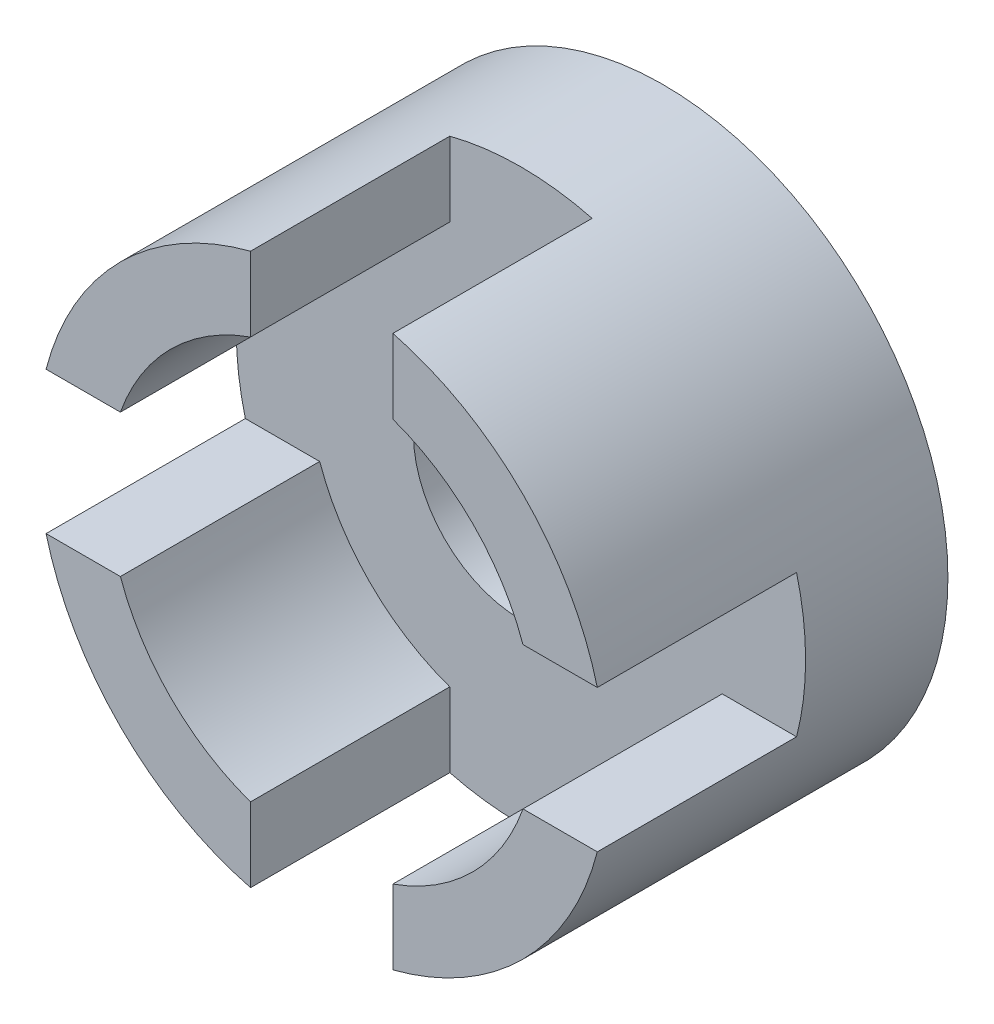
ISO-10303-21;
HEADER;
FILE_DESCRIPTION(('STEP AP214'),'2;1');
FILE_NAME('part.step','',(''),(''),'','','');
FILE_SCHEMA(('AUTOMOTIVE_DESIGN { 1 0 10303 214 1 1 1 1 }'));
ENDSEC;
DATA;
#1=APPLICATION_CONTEXT('core data for automotive mechanical design processes');
#2=APPLICATION_PROTOCOL_DEFINITION('international standard','automotive_design',2000,#1);
#3=PRODUCT_CONTEXT('',#1,'mechanical');
#4=PRODUCT('Part','Part','',(#3));
#5=PRODUCT_RELATED_PRODUCT_CATEGORY('part','',(#4));
#6=PRODUCT_DEFINITION_FORMATION('','',#4);
#7=PRODUCT_DEFINITION_CONTEXT('part definition',#1,'design');
#8=PRODUCT_DEFINITION('design','',#6,#7);
#9=PRODUCT_DEFINITION_SHAPE('','',#8);
#10=(LENGTH_UNIT() NAMED_UNIT(*) SI_UNIT(.MILLI.,.METRE.));
#11=(NAMED_UNIT(*) PLANE_ANGLE_UNIT() SI_UNIT($,.RADIAN.));
#12=(NAMED_UNIT(*) SI_UNIT($,.STERADIAN.) SOLID_ANGLE_UNIT());
#13=UNCERTAINTY_MEASURE_WITH_UNIT(LENGTH_MEASURE(1.E-05),#10,'distance_accuracy_value','');
#14=(GEOMETRIC_REPRESENTATION_CONTEXT(3) GLOBAL_UNCERTAINTY_ASSIGNED_CONTEXT((#13)) GLOBAL_UNIT_ASSIGNED_CONTEXT((#10,
#11,#12)) REPRESENTATION_CONTEXT('',''));
#15=CARTESIAN_POINT('',(0.,0.,0.));
#16=DIRECTION('',(0.,0.,1.));
#17=DIRECTION('',(1.,0.,0.));
#18=AXIS2_PLACEMENT_3D('',#15,#16,#17);
#19=CARTESIAN_POINT('',(0.,0.,7.62));
#20=DIRECTION('',(0.,0.,-1.));
#21=DIRECTION('',(-1.,0.,0.));
#22=AXIS2_PLACEMENT_3D('',#19,#20,#21);
#23=CYLINDRICAL_SURFACE('',#22,6.35);
#24=CARTESIAN_POINT('',(0.,0.,0.));
#25=DIRECTION('',(0.,0.,1.));
#26=DIRECTION('',(1.,0.,0.));
#27=AXIS2_PLACEMENT_3D('',#24,#25,#26);
#28=CIRCLE('',#27,6.35);
#29=CARTESIAN_POINT('',(6.35,0.,0.));
#30=VERTEX_POINT('',#29);
#31=EDGE_CURVE('E51',#30,#30,#28,.T.);
#32=ORIENTED_EDGE('',*,*,#31,.T.);
#33=EDGE_LOOP('',(#32));
#34=FACE_BOUND('',#33,.T.);
#35=DIRECTION('',(0.,0.,1.));
#36=VECTOR('',#35,1.);
#37=CARTESIAN_POINT('',(-6.14836106210428,1.58749999999998,-0.504639742041458));
#38=LINE('',#37,#36);
#39=CARTESIAN_POINT('',(-6.14836106210428,1.58749999999998,3.175));
#40=VERTEX_POINT('',#39);
#41=CARTESIAN_POINT('',(-6.14836106210428,1.58749999999998,7.62));
#42=VERTEX_POINT('',#41);
#43=EDGE_CURVE('E165',#40,#42,#38,.T.);
#44=ORIENTED_EDGE('',*,*,#43,.T.);
#45=CARTESIAN_POINT('',(0.,0.,7.62));
#46=DIRECTION('',(0.,0.,1.));
#47=DIRECTION('',(1.,0.,0.));
#48=AXIS2_PLACEMENT_3D('',#45,#46,#47);
#49=CIRCLE('',#48,6.35);
#50=CARTESIAN_POINT('',(-1.5875,6.14836106210428,7.62));
#51=VERTEX_POINT('',#50);
#52=EDGE_CURVE('E12',#51,#42,#49,.T.);
#53=ORIENTED_EDGE('',*,*,#52,.F.);
#54=DIRECTION('',(0.,0.,1.));
#55=VECTOR('',#54,1.);
#56=CARTESIAN_POINT('',(-1.5875,6.14836106210428,-0.504639742041451));
#57=LINE('',#56,#55);
#58=CARTESIAN_POINT('',(-1.5875,6.14836106210428,3.175));
#59=VERTEX_POINT('',#58);
#60=EDGE_CURVE('E194',#59,#51,#57,.T.);
#61=ORIENTED_EDGE('',*,*,#60,.F.);
#62=CARTESIAN_POINT('',(0.,0.,3.175));
#63=DIRECTION('',(0.,0.,1.));
#64=DIRECTION('',(1.,0.,0.));
#65=AXIS2_PLACEMENT_3D('',#62,#63,#64);
#66=CIRCLE('',#65,6.35);
#67=CARTESIAN_POINT('',(1.5875,6.14836106210427,3.175));
#68=VERTEX_POINT('',#67);
#69=EDGE_CURVE('E207',#59,#68,#66,.F.);
#70=ORIENTED_EDGE('',*,*,#69,.T.);
#71=DIRECTION('',(0.,0.,1.));
#72=VECTOR('',#71,1.);
#73=CARTESIAN_POINT('',(1.5875,6.14836106210427,-0.504639742041451));
#74=LINE('',#73,#72);
#75=CARTESIAN_POINT('',(1.5875,6.14836106210427,7.62));
#76=VERTEX_POINT('',#75);
#77=EDGE_CURVE('E190',#68,#76,#74,.T.);
#78=ORIENTED_EDGE('',*,*,#77,.T.);
#79=CARTESIAN_POINT('',(6.14836106210426,1.58750000000006,7.62));
#80=VERTEX_POINT('',#79);
#81=EDGE_CURVE('E57',#80,#76,#49,.T.);
#82=ORIENTED_EDGE('',*,*,#81,.F.);
#83=DIRECTION('',(0.,0.,1.));
#84=VECTOR('',#83,1.);
#85=CARTESIAN_POINT('',(6.14836106210426,1.58750000000006,-0.504639742041474));
#86=LINE('',#85,#84);
#87=CARTESIAN_POINT('',(6.14836106210426,1.58750000000006,3.175));
#88=VERTEX_POINT('',#87);
#89=EDGE_CURVE('E288',#88,#80,#86,.T.);
#90=ORIENTED_EDGE('',*,*,#89,.F.);
#91=CARTESIAN_POINT('',(0.,0.,3.175));
#92=DIRECTION('',(0.,0.,1.));
#93=DIRECTION('',(1.,0.,0.));
#94=AXIS2_PLACEMENT_3D('',#91,#92,#93);
#95=CIRCLE('',#94,6.35);
#96=CARTESIAN_POINT('',(6.14836106210429,-1.58749999999994,3.175));
#97=VERTEX_POINT('',#96);
#98=EDGE_CURVE('E263',#88,#97,#95,.F.);
#99=ORIENTED_EDGE('',*,*,#98,.T.);
#100=DIRECTION('',(0.,0.,1.));
#101=VECTOR('',#100,1.);
#102=CARTESIAN_POINT('',(6.14836106210429,-1.58749999999994,-0.504639742041474));
#103=LINE('',#102,#101);
#104=CARTESIAN_POINT('',(6.14836106210429,-1.58749999999994,7.62));
#105=VERTEX_POINT('',#104);
#106=EDGE_CURVE('E284',#97,#105,#103,.T.);
#107=ORIENTED_EDGE('',*,*,#106,.T.);
#108=CARTESIAN_POINT('',(1.5875,-6.14836106210428,7.62));
#109=VERTEX_POINT('',#108);
#110=EDGE_CURVE('E344',#109,#105,#49,.T.);
#111=ORIENTED_EDGE('',*,*,#110,.F.);
#112=DIRECTION('',(0.,0.,1.));
#113=VECTOR('',#112,1.);
#114=CARTESIAN_POINT('',(1.5875,-6.14836106210428,-0.504639742041451));
#115=LINE('',#114,#113);
#116=CARTESIAN_POINT('',(1.5875,-6.14836106210428,3.175));
#117=VERTEX_POINT('',#116);
#118=EDGE_CURVE('E268',#117,#109,#115,.T.);
#119=ORIENTED_EDGE('',*,*,#118,.F.);
#120=CARTESIAN_POINT('',(0.,0.,3.175));
#121=DIRECTION('',(0.,0.,1.));
#122=DIRECTION('',(1.,0.,0.));
#123=AXIS2_PLACEMENT_3D('',#120,#121,#122);
#124=CIRCLE('',#123,6.35);
#125=CARTESIAN_POINT('',(-1.5875,-6.14836106210427,3.175));
#126=VERTEX_POINT('',#125);
#127=EDGE_CURVE('E173',#117,#126,#124,.F.);
#128=ORIENTED_EDGE('',*,*,#127,.T.);
#129=DIRECTION('',(0.,0.,1.));
#130=VECTOR('',#129,1.);
#131=CARTESIAN_POINT('',(-1.5875,-6.14836106210427,-0.504639742041451));
#132=LINE('',#131,#130);
#133=CARTESIAN_POINT('',(-1.5875,-6.14836106210427,7.62));
#134=VERTEX_POINT('',#133);
#135=EDGE_CURVE('E265',#126,#134,#132,.T.);
#136=ORIENTED_EDGE('',*,*,#135,.T.);
#137=CARTESIAN_POINT('',(-6.14836106210427,-1.58750000000002,7.62));
#138=VERTEX_POINT('',#137);
#139=EDGE_CURVE('E56',#138,#134,#49,.T.);
#140=ORIENTED_EDGE('',*,*,#139,.F.);
#141=DIRECTION('',(0.,0.,1.));
#142=VECTOR('',#141,1.);
#143=CARTESIAN_POINT('',(-6.14836106210427,-1.58750000000002,-0.504639742041458));
#144=LINE('',#143,#142);
#145=CARTESIAN_POINT('',(-6.14836106210427,-1.58750000000002,3.175));
#146=VERTEX_POINT('',#145);
#147=EDGE_CURVE('E181',#146,#138,#144,.T.);
#148=ORIENTED_EDGE('',*,*,#147,.F.);
#149=CARTESIAN_POINT('',(0.,0.,3.175));
#150=DIRECTION('',(0.,0.,1.));
#151=DIRECTION('',(1.,0.,0.));
#152=AXIS2_PLACEMENT_3D('',#149,#150,#151);
#153=CIRCLE('',#152,6.35);
#154=EDGE_CURVE('E180',#146,#40,#153,.F.);
#155=ORIENTED_EDGE('',*,*,#154,.T.);
#156=EDGE_LOOP('',(#44,#53,#61,#70,#78,#82,#90,#99,#107,#111,#119,#128,#136,#140,#148,#155));
#157=FACE_BOUND('',#156,.T.);
#158=ADVANCED_FACE('F48',(#34,#157),#23,.T.);
#159=CARTESIAN_POINT('',(0.,0.,7.62));
#160=DIRECTION('',(0.,0.,1.));
#161=DIRECTION('',(1.,0.,0.));
#162=AXIS2_PLACEMENT_3D('',#159,#160,#161);
#163=PLANE('',#162);
#164=ORIENTED_EDGE('',*,*,#52,.T.);
#165=DIRECTION('',(1.,0.,0.));
#166=VECTOR('',#165,1.);
#167=CARTESIAN_POINT('',(0.,1.5875,7.62));
#168=LINE('',#167,#166);
#169=CARTESIAN_POINT('',(-4.49012806053458,1.58749999999998,7.62));
#170=VERTEX_POINT('',#169);
#171=EDGE_CURVE('E162',#42,#170,#168,.T.);
#172=ORIENTED_EDGE('',*,*,#171,.T.);
#173=CARTESIAN_POINT('',(0.,0.,7.62));
#174=DIRECTION('',(0.,0.,1.));
#175=DIRECTION('',(1.,0.,0.));
#176=AXIS2_PLACEMENT_3D('',#173,#174,#175);
#177=CIRCLE('',#176,4.7625);
#178=CARTESIAN_POINT('',(-1.5875,4.49012806053458,7.62));
#179=VERTEX_POINT('',#178);
#180=EDGE_CURVE('E186',#179,#170,#177,.T.);
#181=ORIENTED_EDGE('',*,*,#180,.F.);
#182=DIRECTION('',(0.,-1.,0.));
#183=VECTOR('',#182,1.);
#184=CARTESIAN_POINT('',(-1.5875,0.,7.62));
#185=LINE('',#184,#183);
#186=EDGE_CURVE('E185',#51,#179,#185,.T.);
#187=ORIENTED_EDGE('',*,*,#186,.F.);
#188=EDGE_LOOP('',(#164,#172,#181,#187));
#189=FACE_BOUND('',#188,.T.);
#190=ADVANCED_FACE('F184',(#189),#163,.T.);
#191=DIRECTION('',(1.,0.,0.));
#192=VECTOR('',#191,1.);
#193=CARTESIAN_POINT('',(0.,-1.5875,7.62));
#194=LINE('',#193,#192);
#195=CARTESIAN_POINT('',(-4.49012806053457,-1.58750000000002,7.62));
#196=VERTEX_POINT('',#195);
#197=EDGE_CURVE('E172',#138,#196,#194,.T.);
#198=ORIENTED_EDGE('',*,*,#197,.F.);
#199=ORIENTED_EDGE('',*,*,#139,.T.);
#200=DIRECTION('',(0.,1.,0.));
#201=VECTOR('',#200,1.);
#202=CARTESIAN_POINT('',(-1.5875,0.,7.62));
#203=LINE('',#202,#201);
#204=CARTESIAN_POINT('',(-1.5875,-4.49012806053458,7.62));
#205=VERTEX_POINT('',#204);
#206=EDGE_CURVE('E259',#134,#205,#203,.T.);
#207=ORIENTED_EDGE('',*,*,#206,.T.);
#208=EDGE_CURVE('E220',#196,#205,#177,.T.);
#209=ORIENTED_EDGE('',*,*,#208,.F.);
#210=EDGE_LOOP('',(#198,#199,#207,#209));
#211=FACE_BOUND('',#210,.T.);
#212=ADVANCED_FACE('F314',(#211),#163,.T.);
#213=DIRECTION('',(0.,1.,0.));
#214=VECTOR('',#213,1.);
#215=CARTESIAN_POINT('',(1.5875,0.,7.62));
#216=LINE('',#215,#214);
#217=CARTESIAN_POINT('',(1.5875,-4.49012806053458,7.62));
#218=VERTEX_POINT('',#217);
#219=EDGE_CURVE('E262',#109,#218,#216,.T.);
#220=ORIENTED_EDGE('',*,*,#219,.F.);
#221=ORIENTED_EDGE('',*,*,#110,.T.);
#222=DIRECTION('',(-1.,0.,0.));
#223=VECTOR('',#222,1.);
#224=CARTESIAN_POINT('',(0.,-1.5875,7.62));
#225=LINE('',#224,#223);
#226=CARTESIAN_POINT('',(4.49012806053459,-1.58749999999995,7.62));
#227=VERTEX_POINT('',#226);
#228=EDGE_CURVE('E279',#105,#227,#225,.T.);
#229=ORIENTED_EDGE('',*,*,#228,.T.);
#230=EDGE_CURVE('E515',#218,#227,#177,.T.);
#231=ORIENTED_EDGE('',*,*,#230,.F.);
#232=EDGE_LOOP('',(#220,#221,#229,#231));
#233=FACE_BOUND('',#232,.T.);
#234=ADVANCED_FACE('F305',(#233),#163,.T.);
#235=CARTESIAN_POINT('',(0.,0.,-13.4703841816037));
#236=DIRECTION('',(0.,0.,1.));
#237=DIRECTION('',(1.,0.,0.));
#238=AXIS2_PLACEMENT_3D('',#235,#236,#237);
#239=CYLINDRICAL_SURFACE('',#238,4.7625);
#240=DIRECTION('',(0.,0.,1.));
#241=VECTOR('',#240,1.);
#242=CARTESIAN_POINT('',(-4.49012806053458,1.58749999999998,-0.504639742041458));
#243=LINE('',#242,#241);
#244=CARTESIAN_POINT('',(-4.49012806053458,1.58749999999999,3.175));
#245=VERTEX_POINT('',#244);
#246=EDGE_CURVE('E168',#245,#170,#243,.T.);
#247=ORIENTED_EDGE('',*,*,#246,.F.);
#248=CARTESIAN_POINT('',(0.,0.,3.175));
#249=DIRECTION('',(0.,0.,1.));
#250=DIRECTION('',(1.,0.,0.));
#251=AXIS2_PLACEMENT_3D('',#248,#249,#250);
#252=CIRCLE('',#251,4.7625);
#253=CARTESIAN_POINT('',(-1.5875,4.49012806053458,3.175));
#254=VERTEX_POINT('',#253);
#255=EDGE_CURVE('E219',#245,#254,#252,.F.);
#256=ORIENTED_EDGE('',*,*,#255,.T.);
#257=DIRECTION('',(0.,0.,1.));
#258=VECTOR('',#257,1.);
#259=CARTESIAN_POINT('',(-1.5875,4.49012806053458,-0.504639742041451));
#260=LINE('',#259,#258);
#261=EDGE_CURVE('E204',#254,#179,#260,.T.);
#262=ORIENTED_EDGE('',*,*,#261,.T.);
#263=ORIENTED_EDGE('',*,*,#180,.T.);
#264=EDGE_LOOP('',(#247,#256,#262,#263));
#265=FACE_BOUND('',#264,.T.);
#266=ADVANCED_FACE('F303',(#265),#239,.F.);
#267=CARTESIAN_POINT('',(-1.5875,-4.49012806053458,3.175));
#268=VERTEX_POINT('',#267);
#269=CARTESIAN_POINT('',(-4.49012806053457,-1.58750000000002,3.175));
#270=VERTEX_POINT('',#269);
#271=EDGE_CURVE('E230',#268,#270,#252,.F.);
#272=ORIENTED_EDGE('',*,*,#271,.T.);
#273=DIRECTION('',(0.,0.,1.));
#274=VECTOR('',#273,1.);
#275=CARTESIAN_POINT('',(-4.49012806053457,-1.58750000000002,-0.504639742041458));
#276=LINE('',#275,#274);
#277=EDGE_CURVE('E64',#270,#196,#276,.T.);
#278=ORIENTED_EDGE('',*,*,#277,.T.);
#279=ORIENTED_EDGE('',*,*,#208,.T.);
#280=DIRECTION('',(0.,0.,1.));
#281=VECTOR('',#280,1.);
#282=CARTESIAN_POINT('',(-1.5875,-4.49012806053458,-0.504639742041451));
#283=LINE('',#282,#281);
#284=EDGE_CURVE('E240',#268,#205,#283,.T.);
#285=ORIENTED_EDGE('',*,*,#284,.F.);
#286=EDGE_LOOP('',(#272,#278,#279,#285));
#287=FACE_BOUND('',#286,.T.);
#288=ADVANCED_FACE('F237',(#287),#239,.F.);
#289=CARTESIAN_POINT('',(4.49012806053459,-1.58749999999995,3.175));
#290=VERTEX_POINT('',#289);
#291=CARTESIAN_POINT('',(1.5875,-4.49012806053458,3.175));
#292=VERTEX_POINT('',#291);
#293=EDGE_CURVE('E223',#290,#292,#252,.F.);
#294=ORIENTED_EDGE('',*,*,#293,.T.);
#295=DIRECTION('',(0.,0.,1.));
#296=VECTOR('',#295,1.);
#297=CARTESIAN_POINT('',(1.5875,-4.49012806053458,-0.504639742041451));
#298=LINE('',#297,#296);
#299=EDGE_CURVE('E72',#292,#218,#298,.T.);
#300=ORIENTED_EDGE('',*,*,#299,.T.);
#301=ORIENTED_EDGE('',*,*,#230,.T.);
#302=DIRECTION('',(0.,0.,1.));
#303=VECTOR('',#302,1.);
#304=CARTESIAN_POINT('',(4.49012806053459,-1.58749999999995,-0.504639742041474));
#305=LINE('',#304,#303);
#306=EDGE_CURVE('E277',#290,#227,#305,.T.);
#307=ORIENTED_EDGE('',*,*,#306,.F.);
#308=EDGE_LOOP('',(#294,#300,#301,#307));
#309=FACE_BOUND('',#308,.T.);
#310=ADVANCED_FACE('F312',(#309),#239,.F.);
#311=DIRECTION('',(-1.,0.,0.));
#312=VECTOR('',#311,1.);
#313=CARTESIAN_POINT('',(0.,1.5875,7.62));
#314=LINE('',#313,#312);
#315=CARTESIAN_POINT('',(4.49012806053456,1.58750000000005,7.62));
#316=VERTEX_POINT('',#315);
#317=EDGE_CURVE('E282',#80,#316,#314,.T.);
#318=ORIENTED_EDGE('',*,*,#317,.F.);
#319=ORIENTED_EDGE('',*,*,#81,.T.);
#320=DIRECTION('',(0.,-1.,0.));
#321=VECTOR('',#320,1.);
#322=CARTESIAN_POINT('',(1.5875,0.,7.62));
#323=LINE('',#322,#321);
#324=CARTESIAN_POINT('',(1.5875,4.49012806053458,7.62));
#325=VERTEX_POINT('',#324);
#326=EDGE_CURVE('E191',#76,#325,#323,.T.);
#327=ORIENTED_EDGE('',*,*,#326,.T.);
#328=EDGE_CURVE('E217',#316,#325,#177,.T.);
#329=ORIENTED_EDGE('',*,*,#328,.F.);
#330=EDGE_LOOP('',(#318,#319,#327,#329));
#331=FACE_BOUND('',#330,.T.);
#332=ADVANCED_FACE('F317',(#331),#163,.T.);
#333=CARTESIAN_POINT('',(1.5875,4.49012806053458,3.175));
#334=VERTEX_POINT('',#333);
#335=CARTESIAN_POINT('',(4.49012806053456,1.58750000000005,3.175));
#336=VERTEX_POINT('',#335);
#337=EDGE_CURVE('E221',#334,#336,#252,.F.);
#338=ORIENTED_EDGE('',*,*,#337,.T.);
#339=DIRECTION('',(0.,0.,1.));
#340=VECTOR('',#339,1.);
#341=CARTESIAN_POINT('',(4.49012806053456,1.58750000000005,-0.504639742041474));
#342=LINE('',#341,#340);
#343=EDGE_CURVE('E286',#336,#316,#342,.T.);
#344=ORIENTED_EDGE('',*,*,#343,.T.);
#345=ORIENTED_EDGE('',*,*,#328,.T.);
#346=DIRECTION('',(0.,0.,1.));
#347=VECTOR('',#346,1.);
#348=CARTESIAN_POINT('',(1.5875,4.49012806053458,-0.504639742041451));
#349=LINE('',#348,#347);
#350=EDGE_CURVE('E200',#334,#325,#349,.T.);
#351=ORIENTED_EDGE('',*,*,#350,.F.);
#352=EDGE_LOOP('',(#338,#344,#345,#351));
#353=FACE_BOUND('',#352,.T.);
#354=ADVANCED_FACE('F307',(#353),#239,.F.);
#355=CARTESIAN_POINT('',(0.,0.,0.));
#356=DIRECTION('',(0.,0.,1.));
#357=DIRECTION('',(1.,0.,0.));
#358=AXIS2_PLACEMENT_3D('',#355,#356,#357);
#359=PLANE('',#358);
#360=CARTESIAN_POINT('',(0.,0.,0.));
#361=DIRECTION('',(0.,0.,1.));
#362=DIRECTION('',(1.,0.,0.));
#363=AXIS2_PLACEMENT_3D('',#360,#361,#362);
#364=CIRCLE('',#363,2.4);
#365=CARTESIAN_POINT('',(2.4,0.,0.));
#366=VERTEX_POINT('',#365);
#367=EDGE_CURVE('E214',#366,#366,#364,.T.);
#368=ORIENTED_EDGE('',*,*,#367,.T.);
#369=EDGE_LOOP('',(#368));
#370=FACE_BOUND('',#369,.T.);
#371=ORIENTED_EDGE('',*,*,#31,.F.);
#372=EDGE_LOOP('',(#371));
#373=FACE_BOUND('',#372,.T.);
#374=ADVANCED_FACE('F320',(#370,#373),#359,.F.);
#375=CARTESIAN_POINT('',(0.,0.,3.175));
#376=DIRECTION('',(0.,0.,1.));
#377=DIRECTION('',(1.,0.,0.));
#378=AXIS2_PLACEMENT_3D('',#375,#376,#377);
#379=PLANE('',#378);
#380=CARTESIAN_POINT('',(0.,0.,3.175));
#381=DIRECTION('',(0.,0.,1.));
#382=DIRECTION('',(1.,0.,0.));
#383=AXIS2_PLACEMENT_3D('',#380,#381,#382);
#384=CIRCLE('',#383,2.4);
#385=CARTESIAN_POINT('',(2.4,0.,3.175));
#386=VERTEX_POINT('',#385);
#387=EDGE_CURVE('E210',#386,#386,#384,.T.);
#388=ORIENTED_EDGE('',*,*,#387,.F.);
#389=EDGE_LOOP('',(#388));
#390=FACE_BOUND('',#389,.T.);
#391=ORIENTED_EDGE('',*,*,#337,.F.);
#392=DIRECTION('',(0.,1.,0.));
#393=VECTOR('',#392,1.);
#394=CARTESIAN_POINT('',(1.5875,0.,3.175));
#395=LINE('',#394,#393);
#396=EDGE_CURVE('E211',#334,#68,#395,.T.);
#397=ORIENTED_EDGE('',*,*,#396,.T.);
#398=ORIENTED_EDGE('',*,*,#69,.F.);
#399=DIRECTION('',(0.,1.,0.));
#400=VECTOR('',#399,1.);
#401=CARTESIAN_POINT('',(-1.5875,0.,3.175));
#402=LINE('',#401,#400);
#403=EDGE_CURVE('E203',#254,#59,#402,.T.);
#404=ORIENTED_EDGE('',*,*,#403,.F.);
#405=ORIENTED_EDGE('',*,*,#255,.F.);
#406=DIRECTION('',(-1.,0.,0.));
#407=VECTOR('',#406,1.);
#408=CARTESIAN_POINT('',(0.,1.5875,3.175));
#409=LINE('',#408,#407);
#410=EDGE_CURVE('E247',#245,#40,#409,.T.);
#411=ORIENTED_EDGE('',*,*,#410,.T.);
#412=ORIENTED_EDGE('',*,*,#154,.F.);
#413=DIRECTION('',(-1.,0.,0.));
#414=VECTOR('',#413,1.);
#415=CARTESIAN_POINT('',(0.,-1.5875,3.175));
#416=LINE('',#415,#414);
#417=EDGE_CURVE('E246',#270,#146,#416,.T.);
#418=ORIENTED_EDGE('',*,*,#417,.F.);
#419=ORIENTED_EDGE('',*,*,#271,.F.);
#420=DIRECTION('',(0.,-1.,0.));
#421=VECTOR('',#420,1.);
#422=CARTESIAN_POINT('',(-1.5875,0.,3.175));
#423=LINE('',#422,#421);
#424=EDGE_CURVE('E244',#268,#126,#423,.T.);
#425=ORIENTED_EDGE('',*,*,#424,.T.);
#426=ORIENTED_EDGE('',*,*,#127,.F.);
#427=DIRECTION('',(0.,-1.,0.));
#428=VECTOR('',#427,1.);
#429=CARTESIAN_POINT('',(1.5875,0.,3.175));
#430=LINE('',#429,#428);
#431=EDGE_CURVE('E256',#292,#117,#430,.T.);
#432=ORIENTED_EDGE('',*,*,#431,.F.);
#433=ORIENTED_EDGE('',*,*,#293,.F.);
#434=DIRECTION('',(1.,0.,0.));
#435=VECTOR('',#434,1.);
#436=CARTESIAN_POINT('',(0.,-1.5875,3.175));
#437=LINE('',#436,#435);
#438=EDGE_CURVE('E276',#290,#97,#437,.T.);
#439=ORIENTED_EDGE('',*,*,#438,.T.);
#440=ORIENTED_EDGE('',*,*,#98,.F.);
#441=DIRECTION('',(1.,0.,0.));
#442=VECTOR('',#441,1.);
#443=CARTESIAN_POINT('',(0.,1.5875,3.175));
#444=LINE('',#443,#442);
#445=EDGE_CURVE('E274',#336,#88,#444,.T.);
#446=ORIENTED_EDGE('',*,*,#445,.F.);
#447=EDGE_LOOP('',(#391,#397,#398,#404,#405,#411,#412,#418,#419,#425,#426,#432,#433,#439,#440,#446));
#448=FACE_BOUND('',#447,.T.);
#449=ADVANCED_FACE('F242',(#390,#448),#379,.T.);
#450=CARTESIAN_POINT('',(0.,0.,3.175));
#451=DIRECTION('',(0.,0.,1.));
#452=DIRECTION('',(1.,0.,0.));
#453=AXIS2_PLACEMENT_3D('',#450,#451,#452);
#454=CYLINDRICAL_SURFACE('',#453,2.4);
#455=ORIENTED_EDGE('',*,*,#367,.F.);
#456=EDGE_LOOP('',(#455));
#457=FACE_BOUND('',#456,.T.);
#458=ORIENTED_EDGE('',*,*,#387,.T.);
#459=EDGE_LOOP('',(#458));
#460=FACE_BOUND('',#459,.T.);
#461=ADVANCED_FACE('F332',(#457,#460),#454,.F.);
#462=CARTESIAN_POINT('',(1.5875,0.,-0.504639742041451));
#463=DIRECTION('',(-1.,0.,0.));
#464=DIRECTION('',(0.,-1.,0.));
#465=AXIS2_PLACEMENT_3D('',#462,#463,#464);
#466=PLANE('',#465);
#467=ORIENTED_EDGE('',*,*,#350,.T.);
#468=ORIENTED_EDGE('',*,*,#326,.F.);
#469=ORIENTED_EDGE('',*,*,#77,.F.);
#470=ORIENTED_EDGE('',*,*,#396,.F.);
#471=EDGE_LOOP('',(#467,#468,#469,#470));
#472=FACE_BOUND('',#471,.T.);
#473=ADVANCED_FACE('F300',(#472),#466,.T.);
#474=CARTESIAN_POINT('',(-1.5875,0.,-0.504639742041451));
#475=DIRECTION('',(-1.,0.,0.));
#476=DIRECTION('',(0.,-1.,0.));
#477=AXIS2_PLACEMENT_3D('',#474,#475,#476);
#478=PLANE('',#477);
#479=ORIENTED_EDGE('',*,*,#403,.T.);
#480=ORIENTED_EDGE('',*,*,#60,.T.);
#481=ORIENTED_EDGE('',*,*,#186,.T.);
#482=ORIENTED_EDGE('',*,*,#261,.F.);
#483=EDGE_LOOP('',(#479,#480,#481,#482));
#484=FACE_BOUND('',#483,.T.);
#485=ADVANCED_FACE('F302',(#484),#478,.F.);
#486=CARTESIAN_POINT('',(0.,-1.5875,-0.504639742041474));
#487=DIRECTION('',(0.,1.,0.));
#488=DIRECTION('',(-1.,0.,0.));
#489=AXIS2_PLACEMENT_3D('',#486,#487,#488);
#490=PLANE('',#489);
#491=ORIENTED_EDGE('',*,*,#306,.T.);
#492=ORIENTED_EDGE('',*,*,#228,.F.);
#493=ORIENTED_EDGE('',*,*,#106,.F.);
#494=ORIENTED_EDGE('',*,*,#438,.F.);
#495=EDGE_LOOP('',(#491,#492,#493,#494));
#496=FACE_BOUND('',#495,.T.);
#497=ADVANCED_FACE('F364',(#496),#490,.T.);
#498=CARTESIAN_POINT('',(0.,1.5875,-0.504639742041474));
#499=DIRECTION('',(0.,1.,0.));
#500=DIRECTION('',(-1.,0.,0.));
#501=AXIS2_PLACEMENT_3D('',#498,#499,#500);
#502=PLANE('',#501);
#503=ORIENTED_EDGE('',*,*,#445,.T.);
#504=ORIENTED_EDGE('',*,*,#89,.T.);
#505=ORIENTED_EDGE('',*,*,#317,.T.);
#506=ORIENTED_EDGE('',*,*,#343,.F.);
#507=EDGE_LOOP('',(#503,#504,#505,#506));
#508=FACE_BOUND('',#507,.T.);
#509=ADVANCED_FACE('F357',(#508),#502,.F.);
#510=CARTESIAN_POINT('',(-1.5875,0.,-0.504639742041451));
#511=DIRECTION('',(1.,0.,0.));
#512=DIRECTION('',(0.,1.,0.));
#513=AXIS2_PLACEMENT_3D('',#510,#511,#512);
#514=PLANE('',#513);
#515=ORIENTED_EDGE('',*,*,#284,.T.);
#516=ORIENTED_EDGE('',*,*,#206,.F.);
#517=ORIENTED_EDGE('',*,*,#135,.F.);
#518=ORIENTED_EDGE('',*,*,#424,.F.);
#519=EDGE_LOOP('',(#515,#516,#517,#518));
#520=FACE_BOUND('',#519,.T.);
#521=ADVANCED_FACE('F354',(#520),#514,.T.);
#522=CARTESIAN_POINT('',(1.5875,0.,-0.504639742041451));
#523=DIRECTION('',(1.,0.,0.));
#524=DIRECTION('',(0.,1.,0.));
#525=AXIS2_PLACEMENT_3D('',#522,#523,#524);
#526=PLANE('',#525);
#527=ORIENTED_EDGE('',*,*,#431,.T.);
#528=ORIENTED_EDGE('',*,*,#118,.T.);
#529=ORIENTED_EDGE('',*,*,#219,.T.);
#530=ORIENTED_EDGE('',*,*,#299,.F.);
#531=EDGE_LOOP('',(#527,#528,#529,#530));
#532=FACE_BOUND('',#531,.T.);
#533=ADVANCED_FACE('F356',(#532),#526,.F.);
#534=CARTESIAN_POINT('',(0.,1.5875,-0.504639742041458));
#535=DIRECTION('',(0.,-1.,0.));
#536=DIRECTION('',(1.,0.,0.));
#537=AXIS2_PLACEMENT_3D('',#534,#535,#536);
#538=PLANE('',#537);
#539=ORIENTED_EDGE('',*,*,#246,.T.);
#540=ORIENTED_EDGE('',*,*,#171,.F.);
#541=ORIENTED_EDGE('',*,*,#43,.F.);
#542=ORIENTED_EDGE('',*,*,#410,.F.);
#543=EDGE_LOOP('',(#539,#540,#541,#542));
#544=FACE_BOUND('',#543,.T.);
#545=ADVANCED_FACE('F164',(#544),#538,.T.);
#546=CARTESIAN_POINT('',(0.,-1.5875,-0.504639742041458));
#547=DIRECTION('',(0.,-1.,0.));
#548=DIRECTION('',(1.,0.,0.));
#549=AXIS2_PLACEMENT_3D('',#546,#547,#548);
#550=PLANE('',#549);
#551=ORIENTED_EDGE('',*,*,#417,.T.);
#552=ORIENTED_EDGE('',*,*,#147,.T.);
#553=ORIENTED_EDGE('',*,*,#197,.T.);
#554=ORIENTED_EDGE('',*,*,#277,.F.);
#555=EDGE_LOOP('',(#551,#552,#553,#554));
#556=FACE_BOUND('',#555,.T.);
#557=ADVANCED_FACE('F489',(#556),#550,.F.);
#558=CLOSED_SHELL('',(#158,#190,#212,#234,#266,#288,#310,#332,#354,#374,#449,#461,#473,#485,
#497,#509,#521,#533,#545,#557));
#559=MANIFOLD_SOLID_BREP('B2',#558);
#560=ADVANCED_BREP_SHAPE_REPRESENTATION('',(#18,#559),#14);
#561=SHAPE_DEFINITION_REPRESENTATION(#9,#560);
ENDSEC;
END-ISO-10303-21;
